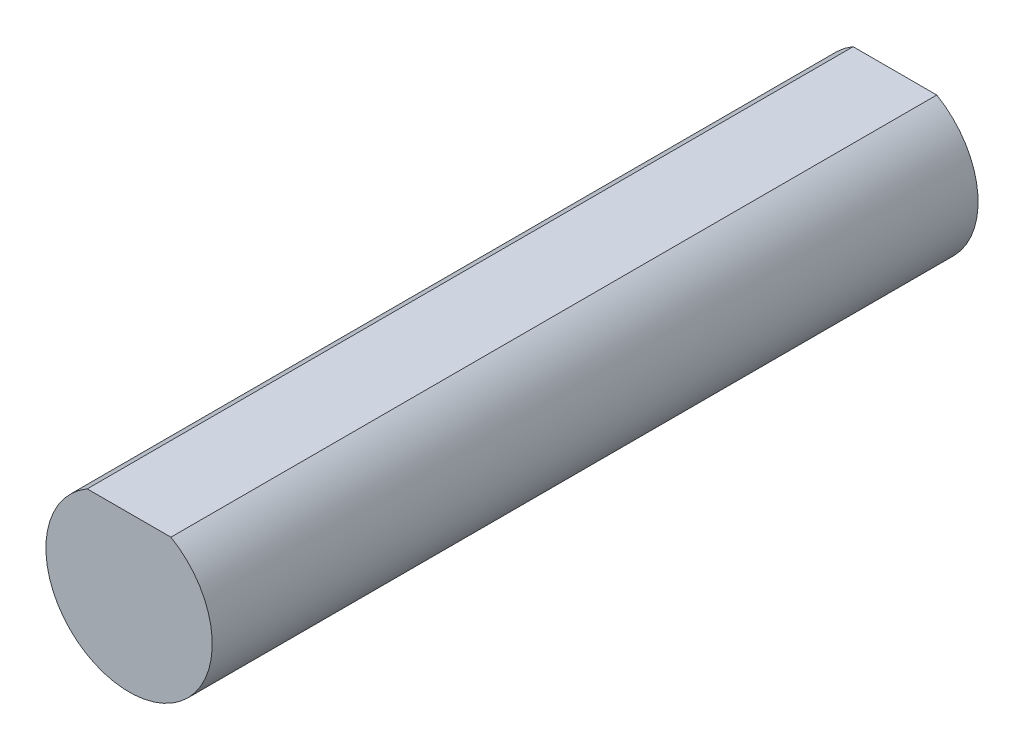
ISO-10303-21;
HEADER;
FILE_DESCRIPTION(('STEP AP214'),'2;1');
FILE_NAME('part.step','',(''),(''),'','','');
FILE_SCHEMA(('AUTOMOTIVE_DESIGN { 1 0 10303 214 1 1 1 1 }'));
ENDSEC;
DATA;
#1=APPLICATION_CONTEXT('core data for automotive mechanical design processes');
#2=APPLICATION_PROTOCOL_DEFINITION('international standard','automotive_design',2000,#1);
#3=PRODUCT_CONTEXT('',#1,'mechanical');
#4=PRODUCT('Part','Part','',(#3));
#5=PRODUCT_RELATED_PRODUCT_CATEGORY('part','',(#4));
#6=PRODUCT_DEFINITION_FORMATION('','',#4);
#7=PRODUCT_DEFINITION_CONTEXT('part definition',#1,'design');
#8=PRODUCT_DEFINITION('design','',#6,#7);
#9=PRODUCT_DEFINITION_SHAPE('','',#8);
#10=(LENGTH_UNIT() NAMED_UNIT(*) SI_UNIT(.MILLI.,.METRE.));
#11=(NAMED_UNIT(*) PLANE_ANGLE_UNIT() SI_UNIT($,.RADIAN.));
#12=(NAMED_UNIT(*) SI_UNIT($,.STERADIAN.) SOLID_ANGLE_UNIT());
#13=UNCERTAINTY_MEASURE_WITH_UNIT(LENGTH_MEASURE(1.E-05),#10,'distance_accuracy_value','');
#14=(GEOMETRIC_REPRESENTATION_CONTEXT(3) GLOBAL_UNCERTAINTY_ASSIGNED_CONTEXT((#13)) GLOBAL_UNIT_ASSIGNED_CONTEXT((#10,
#11,#12)) REPRESENTATION_CONTEXT('',''));
#15=CARTESIAN_POINT('',(0.,0.,0.));
#16=DIRECTION('',(0.,0.,1.));
#17=DIRECTION('',(1.,0.,0.));
#18=AXIS2_PLACEMENT_3D('',#15,#16,#17);
#19=CARTESIAN_POINT('',(0.,0.,36.6));
#20=DIRECTION('',(0.,0.,-1.));
#21=DIRECTION('',(-1.,0.,0.));
#22=AXIS2_PLACEMENT_3D('',#19,#20,#21);
#23=CYLINDRICAL_SURFACE('',#22,3.97500000000001);
#24=CARTESIAN_POINT('',(0.,0.,0.));
#25=DIRECTION('',(0.,0.,1.));
#26=DIRECTION('',(1.,0.,0.));
#27=AXIS2_PLACEMENT_3D('',#24,#25,#26);
#28=CIRCLE('',#27,3.97500000000001);
#29=CARTESIAN_POINT('',(-2.,3.43520377852611,0.));
#30=VERTEX_POINT('',#29);
#31=CARTESIAN_POINT('',(2.,3.43520377852611,0.));
#32=VERTEX_POINT('',#31);
#33=EDGE_CURVE('E64',#30,#32,#28,.T.);
#34=ORIENTED_EDGE('',*,*,#33,.T.);
#35=DIRECTION('',(0.,0.,-1.));
#36=VECTOR('',#35,1.);
#37=CARTESIAN_POINT('',(2.,3.43520377852611,36.6));
#38=LINE('',#37,#36);
#39=CARTESIAN_POINT('',(2.,3.43520377852611,36.6));
#40=VERTEX_POINT('',#39);
#41=EDGE_CURVE('E11',#40,#32,#38,.T.);
#42=ORIENTED_EDGE('',*,*,#41,.F.);
#43=CARTESIAN_POINT('',(0.,0.,36.6));
#44=DIRECTION('',(0.,0.,1.));
#45=DIRECTION('',(1.,0.,0.));
#46=AXIS2_PLACEMENT_3D('',#43,#44,#45);
#47=CIRCLE('',#46,3.97500000000001);
#48=CARTESIAN_POINT('',(-2.,3.43520377852611,36.6));
#49=VERTEX_POINT('',#48);
#50=EDGE_CURVE('E63',#49,#40,#47,.T.);
#51=ORIENTED_EDGE('',*,*,#50,.F.);
#52=DIRECTION('',(0.,0.,-1.));
#53=VECTOR('',#52,1.);
#54=CARTESIAN_POINT('',(-2.,3.43520377852611,36.6));
#55=LINE('',#54,#53);
#56=EDGE_CURVE('E41',#49,#30,#55,.T.);
#57=ORIENTED_EDGE('',*,*,#56,.T.);
#58=EDGE_LOOP('',(#34,#42,#51,#57));
#59=FACE_BOUND('',#58,.T.);
#60=ADVANCED_FACE('F33',(#59),#23,.T.);
#61=CARTESIAN_POINT('',(2.,3.43520377852611,36.6));
#62=DIRECTION('',(0.,-1.,0.));
#63=DIRECTION('',(0.,0.,-1.));
#64=AXIS2_PLACEMENT_3D('',#61,#62,#63);
#65=PLANE('',#64);
#66=DIRECTION('',(-1.,0.,0.));
#67=VECTOR('',#66,1.);
#68=CARTESIAN_POINT('',(2.,3.43520377852611,0.));
#69=LINE('',#68,#67);
#70=EDGE_CURVE('E56',#32,#30,#69,.T.);
#71=ORIENTED_EDGE('',*,*,#70,.T.);
#72=ORIENTED_EDGE('',*,*,#56,.F.);
#73=DIRECTION('',(-1.,0.,0.));
#74=VECTOR('',#73,1.);
#75=CARTESIAN_POINT('',(2.,3.43520377852611,36.6));
#76=LINE('',#75,#74);
#77=EDGE_CURVE('E48',#40,#49,#76,.T.);
#78=ORIENTED_EDGE('',*,*,#77,.F.);
#79=ORIENTED_EDGE('',*,*,#41,.T.);
#80=EDGE_LOOP('',(#71,#72,#78,#79));
#81=FACE_BOUND('',#80,.T.);
#82=ADVANCED_FACE('F59',(#81),#65,.F.);
#83=CARTESIAN_POINT('',(0.,0.,36.6));
#84=DIRECTION('',(0.,0.,1.));
#85=DIRECTION('',(1.,0.,0.));
#86=AXIS2_PLACEMENT_3D('',#83,#84,#85);
#87=PLANE('',#86);
#88=ORIENTED_EDGE('',*,*,#50,.T.);
#89=ORIENTED_EDGE('',*,*,#77,.T.);
#90=EDGE_LOOP('',(#88,#89));
#91=FACE_BOUND('',#90,.T.);
#92=ADVANCED_FACE('F71',(#91),#87,.T.);
#93=CARTESIAN_POINT('',(0.,0.,0.));
#94=DIRECTION('',(0.,0.,1.));
#95=DIRECTION('',(1.,0.,0.));
#96=AXIS2_PLACEMENT_3D('',#93,#94,#95);
#97=PLANE('',#96);
#98=ORIENTED_EDGE('',*,*,#33,.F.);
#99=ORIENTED_EDGE('',*,*,#70,.F.);
#100=EDGE_LOOP('',(#98,#99));
#101=FACE_BOUND('',#100,.T.);
#102=ADVANCED_FACE('F67',(#101),#97,.F.);
#103=CLOSED_SHELL('',(#60,#82,#92,#102));
#104=MANIFOLD_SOLID_BREP('B2',#103);
#105=ADVANCED_BREP_SHAPE_REPRESENTATION('',(#18,#104),#14);
#106=SHAPE_DEFINITION_REPRESENTATION(#9,#105);
ENDSEC;
END-ISO-10303-21;
